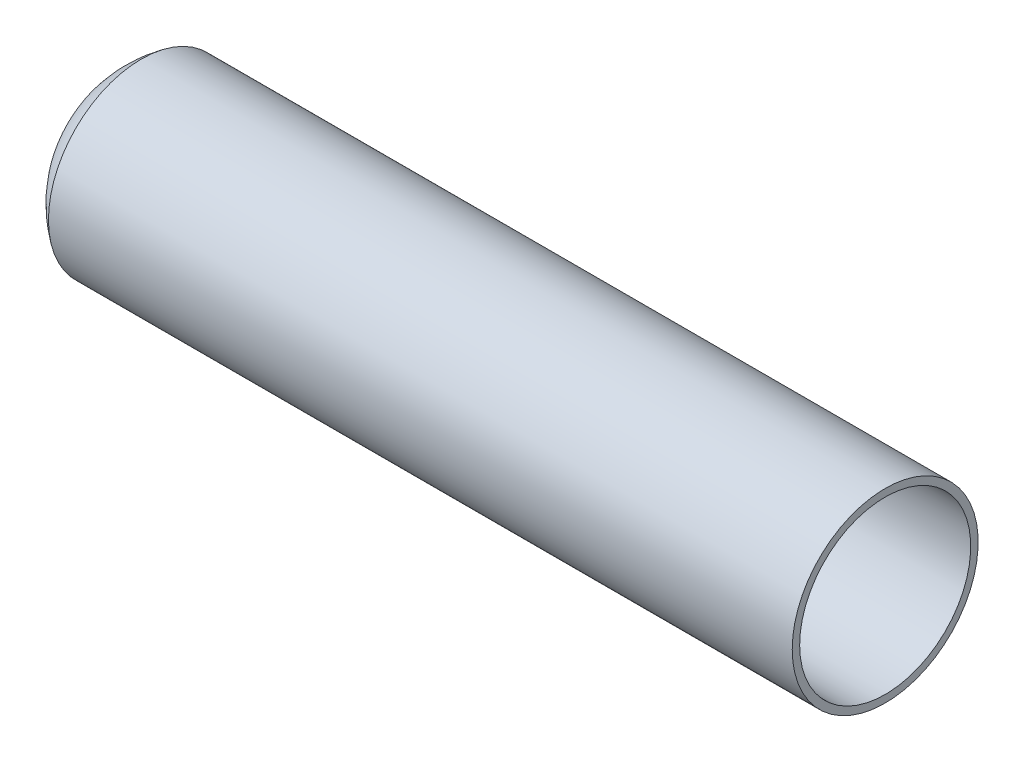
ISO-10303-21;
HEADER;
FILE_DESCRIPTION(('STEP AP214'),'2;1');
FILE_NAME('part.step','',(''),(''),'','','');
FILE_SCHEMA(('AUTOMOTIVE_DESIGN { 1 0 10303 214 1 1 1 1 }'));
ENDSEC;
DATA;
#1=APPLICATION_CONTEXT('core data for automotive mechanical design processes');
#2=APPLICATION_PROTOCOL_DEFINITION('international standard','automotive_design',2000,#1);
#3=PRODUCT_CONTEXT('',#1,'mechanical');
#4=PRODUCT('Part','Part','',(#3));
#5=PRODUCT_RELATED_PRODUCT_CATEGORY('part','',(#4));
#6=PRODUCT_DEFINITION_FORMATION('','',#4);
#7=PRODUCT_DEFINITION_CONTEXT('part definition',#1,'design');
#8=PRODUCT_DEFINITION('design','',#6,#7);
#9=PRODUCT_DEFINITION_SHAPE('','',#8);
#10=(LENGTH_UNIT() NAMED_UNIT(*) SI_UNIT(.MILLI.,.METRE.));
#11=(NAMED_UNIT(*) PLANE_ANGLE_UNIT() SI_UNIT($,.RADIAN.));
#12=(NAMED_UNIT(*) SI_UNIT($,.STERADIAN.) SOLID_ANGLE_UNIT());
#13=UNCERTAINTY_MEASURE_WITH_UNIT(LENGTH_MEASURE(1.E-05),#10,'distance_accuracy_value','');
#14=(GEOMETRIC_REPRESENTATION_CONTEXT(3) GLOBAL_UNCERTAINTY_ASSIGNED_CONTEXT((#13)) GLOBAL_UNIT_ASSIGNED_CONTEXT((#10,
#11,#12)) REPRESENTATION_CONTEXT('',''));
#15=CARTESIAN_POINT('',(0.,0.,0.));
#16=DIRECTION('',(0.,0.,1.));
#17=DIRECTION('',(1.,0.,0.));
#18=AXIS2_PLACEMENT_3D('',#15,#16,#17);
#19=CARTESIAN_POINT('',(14.2,0.,0.));
#20=DIRECTION('',(-1.,0.,0.));
#21=DIRECTION('',(0.,0.,1.));
#22=AXIS2_PLACEMENT_3D('',#19,#20,#21);
#23=CYLINDRICAL_SURFACE('',#22,23.);
#24=CARTESIAN_POINT('',(225.2,0.,0.));
#25=DIRECTION('',(-1.,0.,0.));
#26=DIRECTION('',(0.,0.,1.));
#27=AXIS2_PLACEMENT_3D('',#24,#25,#26);
#28=CIRCLE('',#27,23.);
#29=CARTESIAN_POINT('',(225.2,0.,23.));
#30=VERTEX_POINT('',#29);
#31=EDGE_CURVE('E53',#30,#30,#28,.T.);
#32=ORIENTED_EDGE('',*,*,#31,.F.);
#33=EDGE_LOOP('',(#32));
#34=FACE_BOUND('',#33,.T.);
#35=CARTESIAN_POINT('',(25.8395036229859,0.,0.));
#36=DIRECTION('',(-1.,0.,0.));
#37=DIRECTION('',(0.,0.,1.));
#38=AXIS2_PLACEMENT_3D('',#35,#36,#37);
#39=CIRCLE('',#38,23.);
#40=CARTESIAN_POINT('',(25.8395036229859,23.,0.));
#41=VERTEX_POINT('',#40);
#42=EDGE_CURVE('E10',#41,#41,#39,.T.);
#43=ORIENTED_EDGE('',*,*,#42,.T.);
#44=EDGE_LOOP('',(#43));
#45=FACE_BOUND('',#44,.T.);
#46=ADVANCED_FACE('F31',(#34,#45),#23,.F.);
#47=CARTESIAN_POINT('',(42.6090909090909,0.,0.));
#48=DIRECTION('',(-1.,0.,0.));
#49=DIRECTION('',(0.,1.,0.));
#50=AXIS2_PLACEMENT_3D('',#47,#48,#49);
#51=SPHERICAL_SURFACE('',#50,28.464347133674);
#52=CARTESIAN_POINT('',(16.2,0.,0.));
#53=DIRECTION('',(-1.,0.,0.));
#54=DIRECTION('',(0.,0.,1.));
#55=AXIS2_PLACEMENT_3D('',#52,#53,#54);
#56=CIRCLE('',#55,10.6197445874026);
#57=CARTESIAN_POINT('',(16.2,10.6197445874026,0.));
#58=VERTEX_POINT('',#57);
#59=EDGE_CURVE('E37',#58,#58,#56,.T.);
#60=CARTESIAN_POINT('',(25.8395036229859,23.,0.));
#61=CARTESIAN_POINT('',(25.7057055271771,22.9024463326672,0.));
#62=CARTESIAN_POINT('',(25.5727588682376,22.8037249018296,0.));
#63=CARTESIAN_POINT('',(25.3086084958809,22.6039771335346,0.));
#64=CARTESIAN_POINT('',(25.1774047824636,22.5029507960772,0.));
#65=CARTESIAN_POINT('',(24.9167803729348,22.2986238349328,0.));
#66=CARTESIAN_POINT('',(24.7873596768233,22.1953232112457,0.));
#67=CARTESIAN_POINT('',(24.5303406884147,21.9864791787884,0.));
#68=CARTESIAN_POINT('',(24.4027423961176,21.8809357700182,0.));
#69=CARTESIAN_POINT('',(24.1494070849244,21.6676383012071,0.));
#70=CARTESIAN_POINT('',(24.0236700660283,21.5598842411663,0.));
#71=CARTESIAN_POINT('',(23.7740955941392,21.3421982904103,0.));
#72=CARTESIAN_POINT('',(23.6502581411463,21.2322663996952,0.));
#73=CARTESIAN_POINT('',(23.4045205177675,21.0102582678522,0.));
#74=CARTESIAN_POINT('',(23.2826203473815,20.8981820267243,0.));
#75=CARTESIAN_POINT('',(23.0407944151655,20.6719193283733,0.));
#76=CARTESIAN_POINT('',(22.9208686533354,20.5577328711503,0.));
#77=CARTESIAN_POINT('',(22.6830280630474,20.3272845173574,0.));
#78=CARTESIAN_POINT('',(22.5651132345896,20.2110226207876,0.));
#79=CARTESIAN_POINT('',(22.3313304233568,19.9764587972185,0.));
#80=CARTESIAN_POINT('',(22.2154624405819,19.8581568702192,0.));
#81=CARTESIAN_POINT('',(21.9858086096494,19.6195490160043,0.));
#82=CARTESIAN_POINT('',(21.8720227614919,19.4992430887887,0.));
#83=CARTESIAN_POINT('',(21.6465678545867,19.2566638747009,0.));
#84=CARTESIAN_POINT('',(21.5348987958391,19.1343905878287,0.));
#85=CARTESIAN_POINT('',(21.3137114778545,18.8879138941682,0.));
#86=CARTESIAN_POINT('',(21.2041932186176,18.7637104873798,0.));
#87=CARTESIAN_POINT('',(20.9873408547043,18.513411381468,0.));
#88=CARTESIAN_POINT('',(20.8800067500279,18.3873156823445,0.));
#89=CARTESIAN_POINT('',(20.667555385076,18.133270395663,0.));
#90=CARTESIAN_POINT('',(20.5624381248005,18.0053208081049,0.));
#91=CARTESIAN_POINT('',(20.3544524633251,17.7476067130776,0.));
#92=CARTESIAN_POINT('',(20.2515840621253,17.6178422056085,0.));
#93=CARTESIAN_POINT('',(20.0481274485601,17.3565377920376,0.));
#94=CARTESIAN_POINT('',(19.9475392361948,17.2249978859358,0.));
#95=CARTESIAN_POINT('',(19.7486736355996,16.9601827370962,0.));
#96=CARTESIAN_POINT('',(19.6503962473697,16.8269074943583,0.));
#97=CARTESIAN_POINT('',(19.4561822265584,16.5586622627598,0.));
#98=CARTESIAN_POINT('',(19.3602455939769,16.4236922738992,0.));
#99=CARTESIAN_POINT('',(19.1707423030708,16.152098656723,0.));
#100=CARTESIAN_POINT('',(19.0771756447463,16.0154750284074,0.));
#101=CARTESIAN_POINT('',(18.89244079916,15.7406157426242,0.));
#102=CARTESIAN_POINT('',(18.8012726118983,15.6023800851566,0.));
#103=CARTESIAN_POINT('',(18.6213624747608,15.3243388423341,0.));
#104=CARTESIAN_POINT('',(18.5326205248851,15.1845332569794,0.));
#105=CARTESIAN_POINT('',(18.357589889906,14.9033947377868,0.));
#106=CARTESIAN_POINT('',(18.2713012048026,14.762061803949,0.));
#107=CARTESIAN_POINT('',(18.1012033795785,14.4779116323684,0.));
#108=CARTESIAN_POINT('',(18.0173942394578,14.3350943946256,0.));
#109=CARTESIAN_POINT('',(17.8522810292569,14.0480191118659,0.));
#110=CARTESIAN_POINT('',(17.7709769591768,13.9037610668491,0.));
#111=CARTESIAN_POINT('',(17.6108986510865,13.6138481050206,0.));
#112=CARTESIAN_POINT('',(17.5321244130764,13.4681931882089,0.));
#113=CARTESIAN_POINT('',(17.3771297609663,13.1755308435768,0.));
#114=CARTESIAN_POINT('',(17.3009093468662,13.0285234157564,0.));
#115=CARTESIAN_POINT('',(17.1510455554998,12.7332008222887,0.));
#116=CARTESIAN_POINT('',(17.0774021782334,12.5848856566414,0.));
#117=CARTESIAN_POINT('',(16.9327148927707,12.2869927572228,0.));
#118=CARTESIAN_POINT('',(16.8616709845744,12.1374150234515,0.));
#119=CARTESIAN_POINT('',(16.7222042621937,11.8370425486074,0.));
#120=CARTESIAN_POINT('',(16.6537814480094,11.6862478075345,0.));
#121=CARTESIAN_POINT('',(16.5195777985155,11.3834872249693,0.));
#122=CARTESIAN_POINT('',(16.4537969632059,11.2315213834768,0.));
#123=CARTESIAN_POINT('',(16.3248971344542,10.9264649554133,0.));
#124=CARTESIAN_POINT('',(16.2617781410121,10.7733743688423,0.));
#125=CARTESIAN_POINT('',(16.2,10.6197445874026,0.));
#126=B_SPLINE_CURVE_WITH_KNOTS('',3,(#60,#61,#62,#63,#64,#65,#66,#67,#68,#69,#70,#71,#72,#73,
#74,#75,#76,#77,#78,#79,#80,#81,#82,#83,#84,#85,#86,#87,#88,#89,#90,#91,#92,#93,#94,#95,#96,#97,
#98,#99,#100,#101,#102,#103,#104,#105,#106,#107,#108,#109,#110,#111,#112,#113,#114,#115,#116,
#117,#118,#119,#120,#121,#122,#123,#124,#125),.UNSPECIFIED.,.F.,.F.,(4,2,2,2,2,2,2,2,2,2,2,2,2,
2,2,2,2,2,2,2,2,2,2,2,2,2,2,2,2,2,2,2,4),(0.,0.496751009066577,0.993502018133152,
1.49025302719973,1.9870040362663,2.48375504533288,2.98050605439945,3.47725706346603,
3.9740080725326,4.47075908159918,4.96751009066575,5.46426109973233,5.9610121087989,
6.45776311786548,6.95451412693205,7.45126513599863,7.9480161450652,8.44476715413178,
8.94151816319835,9.43826917226493,9.9350201813315,10.4317711903981,10.9285221994647,
11.4252732085312,11.9220242175978,12.4187752266644,12.915526235731,13.4122772447975,
13.9090282538641,14.4057792629307,14.9025302719973,15.3992812810638,15.8960322901304),.UNSPECIFIED.);
#127=EDGE_CURVE('BSEAM61',#41,#58,#126,.T.);
#128=ORIENTED_EDGE('',*,*,#42,.F.);
#129=ORIENTED_EDGE('',*,*,#59,.T.);
#130=ORIENTED_EDGE('',*,*,#127,.T.);
#131=ORIENTED_EDGE('',*,*,#127,.F.);
#132=EDGE_LOOP('',(#128,#130,#129,#131));
#133=FACE_BOUND('',#132,.T.);
#134=ADVANCED_FACE('F61',(#133),#51,.F.);
#135=CARTESIAN_POINT('',(16.2,0.,0.));
#136=DIRECTION('',(-1.,0.,0.));
#137=DIRECTION('',(0.,0.,1.));
#138=AXIS2_PLACEMENT_3D('',#135,#136,#137);
#139=PLANE('',#138);
#140=ORIENTED_EDGE('',*,*,#59,.F.);
#141=EDGE_LOOP('',(#140));
#142=FACE_BOUND('',#141,.T.);
#143=ADVANCED_FACE('F65',(#142),#139,.F.);
#144=CARTESIAN_POINT('',(14.2,0.,0.));
#145=DIRECTION('',(-1.,0.,0.));
#146=DIRECTION('',(0.,0.,1.));
#147=AXIS2_PLACEMENT_3D('',#144,#145,#146);
#148=PLANE('',#147);
#149=CARTESIAN_POINT('',(14.2,0.,0.));
#150=DIRECTION('',(-1.,0.,0.));
#151=DIRECTION('',(0.,0.,1.));
#152=AXIS2_PLACEMENT_3D('',#149,#150,#151);
#153=CIRCLE('',#152,11.);
#154=CARTESIAN_POINT('',(14.2,11.,0.));
#155=VERTEX_POINT('',#154);
#156=EDGE_CURVE('E41',#155,#155,#153,.T.);
#157=ORIENTED_EDGE('',*,*,#156,.T.);
#158=EDGE_LOOP('',(#157));
#159=FACE_BOUND('',#158,.T.);
#160=ADVANCED_FACE('F70',(#159),#148,.T.);
#161=CARTESIAN_POINT('',(42.6090909090909,0.,0.));
#162=DIRECTION('',(-1.,0.,0.));
#163=DIRECTION('',(0.,1.,0.));
#164=AXIS2_PLACEMENT_3D('',#161,#162,#163);
#165=SPHERICAL_SURFACE('',#164,30.464347133674);
#166=CARTESIAN_POINT('',(25.2,0.,0.));
#167=DIRECTION('',(-1.,0.,0.));
#168=DIRECTION('',(0.,0.,1.));
#169=AXIS2_PLACEMENT_3D('',#166,#167,#168);
#170=CIRCLE('',#169,25.);
#171=CARTESIAN_POINT('',(25.2,25.,0.));
#172=VERTEX_POINT('',#171);
#173=EDGE_CURVE('E45',#172,#172,#170,.T.);
#174=CARTESIAN_POINT('',(25.2,25.,0.));
#175=CARTESIAN_POINT('',(25.0455489316708,24.8924461545626,0.));
#176=CARTESIAN_POINT('',(24.8920948196517,24.7834606607136,0.));
#177=CARTESIAN_POINT('',(24.5872326659543,24.5626645784467,0.));
#178=CARTESIAN_POINT('',(24.4358246242758,24.4508539900288,0.));
#179=CARTESIAN_POINT('',(24.1351067689799,24.224445920878,0.));
#180=CARTESIAN_POINT('',(23.9857969553624,24.1098484401452,0.));
#181=CARTESIAN_POINT('',(23.6893268048365,23.8779060059517,0.));
#182=CARTESIAN_POINT('',(23.5421664679281,23.7605610524912,0.));
#183=CARTESIAN_POINT('',(23.250045831577,23.5231639665224,0.));
#184=CARTESIAN_POINT('',(23.1050855321342,23.4031118340142,0.));
#185=CARTESIAN_POINT('',(22.8174147622292,23.1603416322248,0.));
#186=CARTESIAN_POINT('',(22.674704291767,23.0376235629436,0.));
#187=CARTESIAN_POINT('',(22.3915822021368,22.7895636406389,0.));
#188=CARTESIAN_POINT('',(22.2511705829689,22.6642217876155,0.));
#189=CARTESIAN_POINT('',(21.9726944276065,22.4109573534768,0.));
#190=CARTESIAN_POINT('',(21.8346298914122,22.2830347723614,0.));
#191=CARTESIAN_POINT('',(21.5608953277054,22.024652823819,0.));
#192=CARTESIAN_POINT('',(21.425225300193,21.8941934563918,0.));
#193=CARTESIAN_POINT('',(21.1563263569665,21.6307827484973,0.));
#194=CARTESIAN_POINT('',(21.0230974412525,21.4978314080299,0.));
#195=CARTESIAN_POINT('',(20.7591264862274,21.2294824233021,0.));
#196=CARTESIAN_POINT('',(20.6283844469164,21.0940847790415,0.));
#197=CARTESIAN_POINT('',(20.3694321550462,20.8208896962954,0.));
#198=CARTESIAN_POINT('',(20.241221902487,20.6830922578098,0.));
#199=CARTESIAN_POINT('',(19.9873772247931,20.4051449205175,0.));
#200=CARTESIAN_POINT('',(19.8617427996583,20.2649950217107,0.));
#201=CARTESIAN_POINT('',(19.6130929326796,19.9823909057589,0.));
#202=CARTESIAN_POINT('',(19.4900774908357,19.8399366886138,0.));
#203=CARTESIAN_POINT('',(19.2467078466752,19.5527728695093,0.));
#204=CARTESIAN_POINT('',(19.1263536443587,19.40806326755,0.));
#205=CARTESIAN_POINT('',(18.8883478213443,19.1164383870738,0.));
#206=CARTESIAN_POINT('',(18.7706962006466,18.969523108557,0.));
#207=CARTESIAN_POINT('',(18.5381359546149,18.6735373408804,0.));
#208=CARTESIAN_POINT('',(18.423227329281,18.5244668517205,0.));
#209=CARTESIAN_POINT('',(18.1961925454937,18.2242218689946,0.));
#210=CARTESIAN_POINT('',(18.0840663870403,18.0730473754285,0.));
#211=CARTESIAN_POINT('',(17.8626350527433,17.7686463128599,0.));
#212=CARTESIAN_POINT('',(17.7533298768998,17.6154197438573,0.));
#213=CARTESIAN_POINT('',(17.5375780545346,17.3069671642806,0.));
#214=CARTESIAN_POINT('',(17.4311314080129,17.1517411537064,0.));
#215=CARTESIAN_POINT('',(17.2211332090886,16.8393430116665,0.));
#216=CARTESIAN_POINT('',(17.117581656686,16.6821708802007,0.));
#217=CARTESIAN_POINT('',(16.9134092163216,16.3659344855572,0.));
#218=CARTESIAN_POINT('',(16.8127883283597,16.2068702223795,0.));
#219=CARTESIAN_POINT('',(16.614511780507,15.8869042034448,0.));
#220=CARTESIAN_POINT('',(16.5168561206161,15.7260024476877,0.));
#221=CARTESIAN_POINT('',(16.3245435739615,15.4024167139154,0.));
#222=CARTESIAN_POINT('',(16.2298866871977,15.2397327359001,0.));
#223=CARTESIAN_POINT('',(16.0436042017937,14.9126384401197,0.));
#224=CARTESIAN_POINT('',(15.9519786031534,14.7482281223547,0.));
#225=CARTESIAN_POINT('',(15.7717901676249,14.4177376226323,0.));
#226=CARTESIAN_POINT('',(15.6832273307365,14.2516574406749,0.));
#227=CARTESIAN_POINT('',(15.5091948406811,13.9178842615615,0.));
#228=CARTESIAN_POINT('',(15.423725187514,13.7501912644055,0.));
#229=CARTESIAN_POINT('',(15.2559084228192,13.4132500585224,0.));
#230=CARTESIAN_POINT('',(15.1735613112914,13.2440018497953,0.));
#231=CARTESIAN_POINT('',(15.0120179209064,12.9040083562817,0.));
#232=CARTESIAN_POINT('',(14.9328216420492,12.7332630714952,0.));
#233=CARTESIAN_POINT('',(14.7776071043769,12.3903340843454,0.));
#234=CARTESIAN_POINT('',(14.7015888455617,12.2181503819821,0.));
#235=CARTESIAN_POINT('',(14.552756523318,11.8724036797189,0.));
#236=CARTESIAN_POINT('',(14.4799424598895,11.6988406798189,0.));
#237=CARTESIAN_POINT('',(14.337543305912,11.3503950977721,0.));
#238=CARTESIAN_POINT('',(14.2679582153629,11.1755125156252,0.));
#239=CARTESIAN_POINT('',(14.2,11.,0.));
#240=B_SPLINE_CURVE_WITH_KNOTS('',3,(#174,#175,#176,#177,#178,#179,#180,#181,#182,#183,#184,
#185,#186,#187,#188,#189,#190,#191,#192,#193,#194,#195,#196,#197,#198,#199,#200,#201,#202,#203,
#204,#205,#206,#207,#208,#209,#210,#211,#212,#213,#214,#215,#216,#217,#218,#219,#220,#221,#222,
#223,#224,#225,#226,#227,#228,#229,#230,#231,#232,#233,#234,#235,#236,#237,#238,#239),
.UNSPECIFIED.,.F.,.F.,(4,2,2,2,2,2,2,2,2,2,2,2,2,2,2,2,2,2,2,2,2,2,2,2,2,2,2,2,2,2,2,2,4),(0.,
0.564621572742236,1.12924314548448,1.69386471822672,2.25848629096896,2.8231078637112,
3.38772943645344,3.95235100919567,4.51697258193792,5.08159415468015,5.64621572742239,
6.21083730016463,6.77545887290687,7.34008044564911,7.90470201839135,8.46932359113359,
9.03394516387583,9.59856673661807,10.1631883093603,10.7278098821025,11.2924314548448,
11.857053027587,12.4216746003293,12.9862961730715,13.5509177458137,14.115539318556,
14.6801608912982,15.2447824640405,15.8094040367827,16.3740256095249,16.9386471822672,
17.5032687550094,18.0678903277517),.UNSPECIFIED.);
#241=EDGE_CURVE('BSEAM76',#172,#155,#240,.T.);
#242=ORIENTED_EDGE('',*,*,#173,.T.);
#243=ORIENTED_EDGE('',*,*,#156,.F.);
#244=ORIENTED_EDGE('',*,*,#241,.T.);
#245=ORIENTED_EDGE('',*,*,#241,.F.);
#246=EDGE_LOOP('',(#242,#244,#243,#245));
#247=FACE_BOUND('',#246,.T.);
#248=ADVANCED_FACE('F76',(#247),#165,.T.);
#249=CARTESIAN_POINT('',(14.2,0.,0.));
#250=DIRECTION('',(-1.,0.,0.));
#251=DIRECTION('',(0.,0.,1.));
#252=AXIS2_PLACEMENT_3D('',#249,#250,#251);
#253=CYLINDRICAL_SURFACE('',#252,25.);
#254=CARTESIAN_POINT('',(225.2,0.,0.));
#255=DIRECTION('',(-1.,0.,0.));
#256=DIRECTION('',(0.,0.,1.));
#257=AXIS2_PLACEMENT_3D('',#254,#255,#256);
#258=CIRCLE('',#257,25.);
#259=CARTESIAN_POINT('',(225.2,0.,25.));
#260=VERTEX_POINT('',#259);
#261=EDGE_CURVE('E50',#260,#260,#258,.T.);
#262=ORIENTED_EDGE('',*,*,#261,.T.);
#263=EDGE_LOOP('',(#262));
#264=FACE_BOUND('',#263,.T.);
#265=ORIENTED_EDGE('',*,*,#173,.F.);
#266=EDGE_LOOP('',(#265));
#267=FACE_BOUND('',#266,.T.);
#268=ADVANCED_FACE('F80',(#264,#267),#253,.T.);
#269=CARTESIAN_POINT('',(225.2,25.,0.));
#270=DIRECTION('',(1.,0.,0.));
#271=DIRECTION('',(0.,0.,-1.));
#272=AXIS2_PLACEMENT_3D('',#269,#270,#271);
#273=PLANE('',#272);
#274=ORIENTED_EDGE('',*,*,#31,.T.);
#275=EDGE_LOOP('',(#274));
#276=FACE_BOUND('',#275,.T.);
#277=ORIENTED_EDGE('',*,*,#261,.F.);
#278=EDGE_LOOP('',(#277));
#279=FACE_BOUND('',#278,.T.);
#280=ADVANCED_FACE('F57',(#276,#279),#273,.T.);
#281=CLOSED_SHELL('',(#46,#134,#143,#160,#248,#268,#280));
#282=MANIFOLD_SOLID_BREP('B2',#281);
#283=ADVANCED_BREP_SHAPE_REPRESENTATION('',(#18,#282),#14);
#284=SHAPE_DEFINITION_REPRESENTATION(#9,#283);
ENDSEC;
END-ISO-10303-21;
